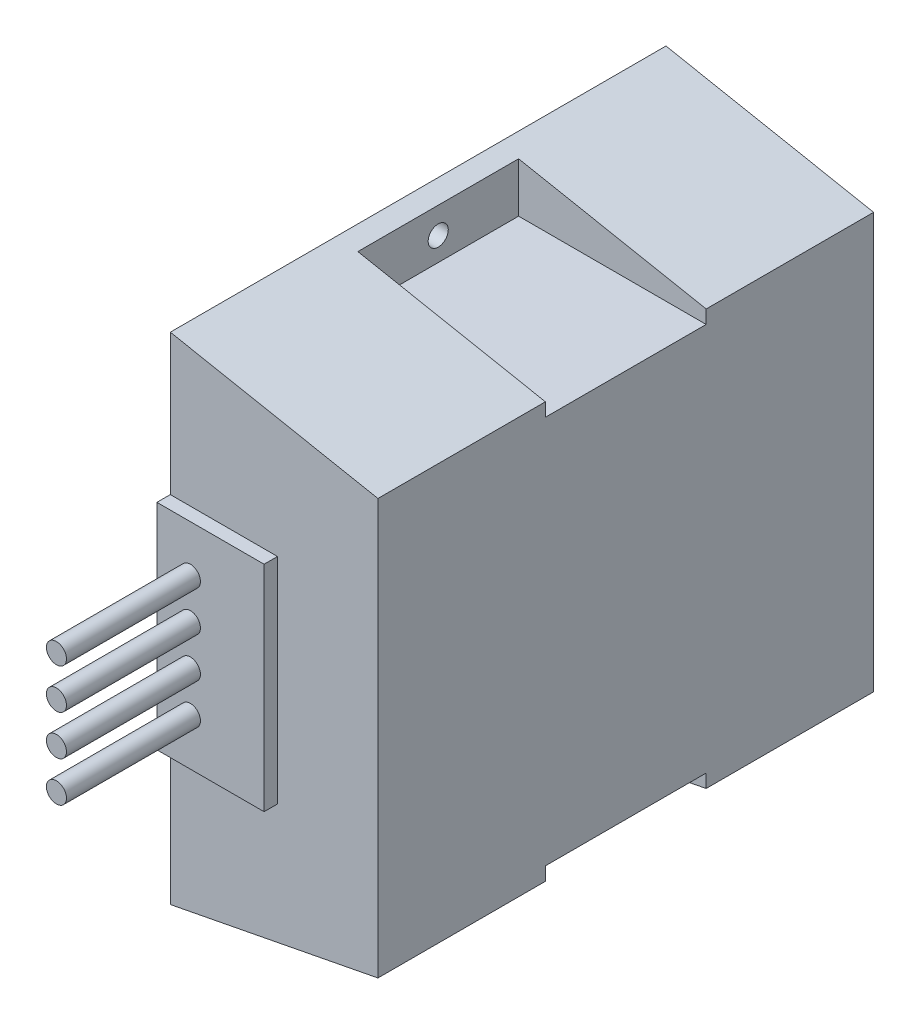
ISO-10303-21;
HEADER;
FILE_DESCRIPTION(('STEP AP214'),'2;1');
FILE_NAME('part.step','',(''),(''),'','','');
FILE_SCHEMA(('AUTOMOTIVE_DESIGN { 1 0 10303 214 1 1 1 1 }'));
ENDSEC;
DATA;
#1=APPLICATION_CONTEXT('core data for automotive mechanical design processes');
#2=APPLICATION_PROTOCOL_DEFINITION('international standard','automotive_design',2000,#1);
#3=PRODUCT_CONTEXT('',#1,'mechanical');
#4=PRODUCT('Part','Part','',(#3));
#5=PRODUCT_RELATED_PRODUCT_CATEGORY('part','',(#4));
#6=PRODUCT_DEFINITION_FORMATION('','',#4);
#7=PRODUCT_DEFINITION_CONTEXT('part definition',#1,'design');
#8=PRODUCT_DEFINITION('design','',#6,#7);
#9=PRODUCT_DEFINITION_SHAPE('','',#8);
#10=(LENGTH_UNIT() NAMED_UNIT(*) SI_UNIT(.MILLI.,.METRE.));
#11=(NAMED_UNIT(*) PLANE_ANGLE_UNIT() SI_UNIT($,.RADIAN.));
#12=(NAMED_UNIT(*) SI_UNIT($,.STERADIAN.) SOLID_ANGLE_UNIT());
#13=UNCERTAINTY_MEASURE_WITH_UNIT(LENGTH_MEASURE(1.E-05),#10,'distance_accuracy_value','');
#14=(GEOMETRIC_REPRESENTATION_CONTEXT(3) GLOBAL_UNCERTAINTY_ASSIGNED_CONTEXT((#13)) GLOBAL_UNIT_ASSIGNED_CONTEXT((#10,
#11,#12)) REPRESENTATION_CONTEXT('',''));
#15=CARTESIAN_POINT('',(0.,0.,0.));
#16=DIRECTION('',(0.,0.,1.));
#17=DIRECTION('',(1.,0.,0.));
#18=AXIS2_PLACEMENT_3D('',#15,#16,#17);
#19=CARTESIAN_POINT('',(31.,0.,0.));
#20=DIRECTION('',(1.,0.,0.));
#21=DIRECTION('',(0.,0.,-1.));
#22=AXIS2_PLACEMENT_3D('',#19,#20,#21);
#23=PLANE('',#22);
#24=DIRECTION('',(0.,0.,-1.));
#25=VECTOR('',#24,1.);
#26=CARTESIAN_POINT('',(31.,-29.,12.));
#27=LINE('',#26,#25);
#28=CARTESIAN_POINT('',(31.,-29.,12.));
#29=VERTEX_POINT('',#28);
#30=CARTESIAN_POINT('',(31.,-29.,-12.));
#31=VERTEX_POINT('',#30);
#32=EDGE_CURVE('E184',#29,#31,#27,.T.);
#33=ORIENTED_EDGE('',*,*,#32,.T.);
#34=DIRECTION('',(0.,-1.,0.));
#35=VECTOR('',#34,1.);
#36=CARTESIAN_POINT('',(31.,-37.,-12.));
#37=LINE('',#36,#35);
#38=CARTESIAN_POINT('',(31.,-31.,-12.));
#39=VERTEX_POINT('',#38);
#40=EDGE_CURVE('E181',#31,#39,#37,.T.);
#41=ORIENTED_EDGE('',*,*,#40,.T.);
#42=DIRECTION('',(0.,0.,-1.));
#43=VECTOR('',#42,1.);
#44=CARTESIAN_POINT('',(31.,-31.,37.));
#45=LINE('',#44,#43);
#46=CARTESIAN_POINT('',(31.,-31.,-37.));
#47=VERTEX_POINT('',#46);
#48=EDGE_CURVE('E326',#39,#47,#45,.T.);
#49=ORIENTED_EDGE('',*,*,#48,.T.);
#50=DIRECTION('',(0.,1.,0.));
#51=VECTOR('',#50,1.);
#52=CARTESIAN_POINT('',(31.,31.,-37.));
#53=LINE('',#52,#51);
#54=CARTESIAN_POINT('',(31.,31.,-37.));
#55=VERTEX_POINT('',#54);
#56=EDGE_CURVE('E328',#47,#55,#53,.T.);
#57=ORIENTED_EDGE('',*,*,#56,.T.);
#58=DIRECTION('',(0.,0.,1.));
#59=VECTOR('',#58,1.);
#60=CARTESIAN_POINT('',(31.,31.,37.));
#61=LINE('',#60,#59);
#62=CARTESIAN_POINT('',(31.,31.,-12.));
#63=VERTEX_POINT('',#62);
#64=EDGE_CURVE('E433',#55,#63,#61,.T.);
#65=ORIENTED_EDGE('',*,*,#64,.T.);
#66=DIRECTION('',(0.,1.,0.));
#67=VECTOR('',#66,1.);
#68=CARTESIAN_POINT('',(31.,37.,-12.));
#69=LINE('',#68,#67);
#70=CARTESIAN_POINT('',(31.,29.,-12.));
#71=VERTEX_POINT('',#70);
#72=EDGE_CURVE('E282',#71,#63,#69,.T.);
#73=ORIENTED_EDGE('',*,*,#72,.F.);
#74=DIRECTION('',(0.,0.,-1.));
#75=VECTOR('',#74,1.);
#76=CARTESIAN_POINT('',(31.,29.,12.));
#77=LINE('',#76,#75);
#78=CARTESIAN_POINT('',(31.,29.,12.));
#79=VERTEX_POINT('',#78);
#80=EDGE_CURVE('E510',#79,#71,#77,.T.);
#81=ORIENTED_EDGE('',*,*,#80,.F.);
#82=DIRECTION('',(0.,-1.,0.));
#83=VECTOR('',#82,1.);
#84=CARTESIAN_POINT('',(31.,37.,12.));
#85=LINE('',#84,#83);
#86=CARTESIAN_POINT('',(31.,31.,12.));
#87=VERTEX_POINT('',#86);
#88=EDGE_CURVE('E286',#87,#79,#85,.T.);
#89=ORIENTED_EDGE('',*,*,#88,.F.);
#90=CARTESIAN_POINT('',(31.,31.,37.));
#91=VERTEX_POINT('',#90);
#92=EDGE_CURVE('E339',#87,#91,#61,.T.);
#93=ORIENTED_EDGE('',*,*,#92,.T.);
#94=DIRECTION('',(0.,-1.,0.));
#95=VECTOR('',#94,1.);
#96=CARTESIAN_POINT('',(31.,31.,37.));
#97=LINE('',#96,#95);
#98=CARTESIAN_POINT('',(31.,-31.,37.));
#99=VERTEX_POINT('',#98);
#100=EDGE_CURVE('E336',#91,#99,#97,.T.);
#101=ORIENTED_EDGE('',*,*,#100,.T.);
#102=CARTESIAN_POINT('',(31.,-31.,12.));
#103=VERTEX_POINT('',#102);
#104=EDGE_CURVE('E303',#99,#103,#45,.T.);
#105=ORIENTED_EDGE('',*,*,#104,.T.);
#106=DIRECTION('',(0.,1.,0.));
#107=VECTOR('',#106,1.);
#108=CARTESIAN_POINT('',(31.,-37.,12.));
#109=LINE('',#108,#107);
#110=EDGE_CURVE('E265',#103,#29,#109,.T.);
#111=ORIENTED_EDGE('',*,*,#110,.T.);
#112=EDGE_LOOP('',(#33,#41,#49,#57,#65,#73,#81,#89,#93,#101,#105,#111));
#113=FACE_BOUND('',#112,.T.);
#114=ADVANCED_FACE('F42',(#113),#23,.T.);
#115=CARTESIAN_POINT('',(6.9027081243731,-35.6639919759278,0.));
#116=DIRECTION('',(0.19002190656586,-0.981779850590282,0.));
#117=DIRECTION('',(0.981779850590282,0.19002190656586,0.));
#118=AXIS2_PLACEMENT_3D('',#115,#116,#117);
#119=PLANE('',#118);
#120=ORIENTED_EDGE('',*,*,#48,.F.);
#121=DIRECTION('',(-0.981779850590282,-0.19002190656586,0.));
#122=VECTOR('',#121,1.);
#123=CARTESIAN_POINT('',(6.9027081243731,-35.6639919759278,-12.));
#124=LINE('',#123,#122);
#125=CARTESIAN_POINT('',(3.,-36.4193548387097,-12.));
#126=VERTEX_POINT('',#125);
#127=EDGE_CURVE('E298',#39,#126,#124,.T.);
#128=ORIENTED_EDGE('',*,*,#127,.T.);
#129=DIRECTION('',(0.,0.,1.));
#130=VECTOR('',#129,1.);
#131=CARTESIAN_POINT('',(3.,-36.4193548387097,0.));
#132=LINE('',#131,#130);
#133=CARTESIAN_POINT('',(3.,-36.4193548387097,12.));
#134=VERTEX_POINT('',#133);
#135=EDGE_CURVE('E315',#126,#134,#132,.T.);
#136=ORIENTED_EDGE('',*,*,#135,.T.);
#137=DIRECTION('',(0.981779850590282,0.19002190656586,0.));
#138=VECTOR('',#137,1.);
#139=CARTESIAN_POINT('',(6.9027081243731,-35.6639919759278,12.));
#140=LINE('',#139,#138);
#141=EDGE_CURVE('E308',#134,#103,#140,.T.);
#142=ORIENTED_EDGE('',*,*,#141,.T.);
#143=ORIENTED_EDGE('',*,*,#104,.F.);
#144=DIRECTION('',(-0.981779850590281,-0.19002190656586,0.));
#145=VECTOR('',#144,1.);
#146=CARTESIAN_POINT('',(31.,-31.,37.));
#147=LINE('',#146,#145);
#148=CARTESIAN_POINT('',(0.,-37.,37.));
#149=VERTEX_POINT('',#148);
#150=EDGE_CURVE('E353',#99,#149,#147,.T.);
#151=ORIENTED_EDGE('',*,*,#150,.T.);
#152=DIRECTION('',(0.,0.,-1.));
#153=VECTOR('',#152,1.);
#154=CARTESIAN_POINT('',(0.,-37.,37.));
#155=LINE('',#154,#153);
#156=CARTESIAN_POINT('',(0.,-37.,-37.));
#157=VERTEX_POINT('',#156);
#158=EDGE_CURVE('E219',#149,#157,#155,.T.);
#159=ORIENTED_EDGE('',*,*,#158,.T.);
#160=DIRECTION('',(-0.981779850590281,-0.19002190656586,0.));
#161=VECTOR('',#160,1.);
#162=CARTESIAN_POINT('',(31.,-31.,-37.));
#163=LINE('',#162,#161);
#164=EDGE_CURVE('E382',#47,#157,#163,.T.);
#165=ORIENTED_EDGE('',*,*,#164,.F.);
#166=EDGE_LOOP('',(#120,#128,#136,#142,#143,#151,#159,#165));
#167=FACE_BOUND('',#166,.T.);
#168=ADVANCED_FACE('F311',(#167),#119,.T.);
#169=CARTESIAN_POINT('',(0.,0.,0.));
#170=DIRECTION('',(1.,0.,0.));
#171=DIRECTION('',(0.,0.,-1.));
#172=AXIS2_PLACEMENT_3D('',#169,#170,#171);
#173=PLANE('',#172);
#174=CARTESIAN_POINT('',(0.,32.5,0.));
#175=DIRECTION('',(1.,0.,0.));
#176=DIRECTION('',(0.,0.,1.));
#177=AXIS2_PLACEMENT_3D('',#174,#175,#176);
#178=CIRCLE('',#177,1.5);
#179=CARTESIAN_POINT('',(0.,32.5,1.5));
#180=VERTEX_POINT('',#179);
#181=EDGE_CURVE('E781',#180,#180,#178,.T.);
#182=ORIENTED_EDGE('',*,*,#181,.T.);
#183=EDGE_LOOP('',(#182));
#184=FACE_BOUND('',#183,.T.);
#185=CARTESIAN_POINT('',(0.,-32.5,0.));
#186=DIRECTION('',(-1.,0.,0.));
#187=DIRECTION('',(0.,0.,1.));
#188=AXIS2_PLACEMENT_3D('',#185,#186,#187);
#189=CIRCLE('',#188,1.5);
#190=CARTESIAN_POINT('',(0.,-32.5,1.5));
#191=VERTEX_POINT('',#190);
#192=EDGE_CURVE('E783',#191,#191,#189,.T.);
#193=ORIENTED_EDGE('',*,*,#192,.F.);
#194=EDGE_LOOP('',(#193));
#195=FACE_BOUND('',#194,.T.);
#196=DIRECTION('',(0.,1.,0.));
#197=VECTOR('',#196,1.);
#198=CARTESIAN_POINT('',(0.,37.,-37.));
#199=LINE('',#198,#197);
#200=CARTESIAN_POINT('',(0.,37.,-37.));
#201=VERTEX_POINT('',#200);
#202=EDGE_CURVE('E212',#157,#201,#199,.T.);
#203=ORIENTED_EDGE('',*,*,#202,.F.);
#204=ORIENTED_EDGE('',*,*,#158,.F.);
#205=DIRECTION('',(0.,-1.,0.));
#206=VECTOR('',#205,1.);
#207=CARTESIAN_POINT('',(0.,37.,37.));
#208=LINE('',#207,#206);
#209=CARTESIAN_POINT('',(0.,-16.,37.));
#210=VERTEX_POINT('',#209);
#211=EDGE_CURVE('E179',#210,#149,#208,.T.);
#212=ORIENTED_EDGE('',*,*,#211,.F.);
#213=DIRECTION('',(0.,0.,-1.));
#214=VECTOR('',#213,1.);
#215=CARTESIAN_POINT('',(0.,-16.,39.));
#216=LINE('',#215,#214);
#217=CARTESIAN_POINT('',(0.,-16.,39.));
#218=VERTEX_POINT('',#217);
#219=EDGE_CURVE('E161',#218,#210,#216,.T.);
#220=ORIENTED_EDGE('',*,*,#219,.F.);
#221=DIRECTION('',(0.,-1.,0.));
#222=VECTOR('',#221,1.);
#223=CARTESIAN_POINT('',(0.,16.,39.));
#224=LINE('',#223,#222);
#225=CARTESIAN_POINT('',(0.,16.,39.));
#226=VERTEX_POINT('',#225);
#227=EDGE_CURVE('E167',#226,#218,#224,.T.);
#228=ORIENTED_EDGE('',*,*,#227,.F.);
#229=DIRECTION('',(0.,0.,-1.));
#230=VECTOR('',#229,1.);
#231=CARTESIAN_POINT('',(0.,16.,39.));
#232=LINE('',#231,#230);
#233=CARTESIAN_POINT('',(0.,16.,37.));
#234=VERTEX_POINT('',#233);
#235=EDGE_CURVE('E256',#226,#234,#232,.T.);
#236=ORIENTED_EDGE('',*,*,#235,.T.);
#237=CARTESIAN_POINT('',(0.,37.,37.));
#238=VERTEX_POINT('',#237);
#239=EDGE_CURVE('E194',#238,#234,#208,.T.);
#240=ORIENTED_EDGE('',*,*,#239,.F.);
#241=DIRECTION('',(0.,0.,1.));
#242=VECTOR('',#241,1.);
#243=CARTESIAN_POINT('',(0.,37.,37.));
#244=LINE('',#243,#242);
#245=EDGE_CURVE('E196',#201,#238,#244,.T.);
#246=ORIENTED_EDGE('',*,*,#245,.F.);
#247=EDGE_LOOP('',(#203,#204,#212,#220,#228,#236,#240,#246));
#248=FACE_BOUND('',#247,.T.);
#249=ADVANCED_FACE('F44',(#184,#195,#248),#173,.F.);
#250=CARTESIAN_POINT('',(0.,0.,-37.));
#251=DIRECTION('',(0.,0.,-1.));
#252=DIRECTION('',(-1.,0.,0.));
#253=AXIS2_PLACEMENT_3D('',#250,#251,#252);
#254=PLANE('',#253);
#255=ORIENTED_EDGE('',*,*,#164,.T.);
#256=ORIENTED_EDGE('',*,*,#202,.T.);
#257=DIRECTION('',(-0.981779850590281,0.190021906565861,0.));
#258=VECTOR('',#257,1.);
#259=CARTESIAN_POINT('',(31.,31.,-37.));
#260=LINE('',#259,#258);
#261=EDGE_CURVE('E364',#55,#201,#260,.T.);
#262=ORIENTED_EDGE('',*,*,#261,.F.);
#263=ORIENTED_EDGE('',*,*,#56,.F.);
#264=EDGE_LOOP('',(#255,#256,#262,#263));
#265=FACE_BOUND('',#264,.T.);
#266=ADVANCED_FACE('F384',(#265),#254,.T.);
#267=CARTESIAN_POINT('',(6.90270812437314,35.6639919759278,0.));
#268=DIRECTION('',(0.190021906565861,0.981779850590281,0.));
#269=DIRECTION('',(-0.981779850590281,0.190021906565861,0.));
#270=AXIS2_PLACEMENT_3D('',#267,#268,#269);
#271=PLANE('',#270);
#272=DIRECTION('',(-0.981779850590281,0.190021906565861,0.));
#273=VECTOR('',#272,1.);
#274=CARTESIAN_POINT('',(6.90270812437314,35.6639919759278,-12.));
#275=LINE('',#274,#273);
#276=CARTESIAN_POINT('',(3.,36.4193548387097,-12.));
#277=VERTEX_POINT('',#276);
#278=EDGE_CURVE('E318',#63,#277,#275,.T.);
#279=ORIENTED_EDGE('',*,*,#278,.F.);
#280=ORIENTED_EDGE('',*,*,#64,.F.);
#281=ORIENTED_EDGE('',*,*,#261,.T.);
#282=ORIENTED_EDGE('',*,*,#245,.T.);
#283=DIRECTION('',(-0.981779850590281,0.190021906565861,0.));
#284=VECTOR('',#283,1.);
#285=CARTESIAN_POINT('',(31.,31.,37.));
#286=LINE('',#285,#284);
#287=EDGE_CURVE('E220',#91,#238,#286,.T.);
#288=ORIENTED_EDGE('',*,*,#287,.F.);
#289=ORIENTED_EDGE('',*,*,#92,.F.);
#290=DIRECTION('',(0.981779850590281,-0.190021906565861,0.));
#291=VECTOR('',#290,1.);
#292=CARTESIAN_POINT('',(6.90270812437314,35.6639919759278,12.));
#293=LINE('',#292,#291);
#294=CARTESIAN_POINT('',(3.,36.4193548387097,12.));
#295=VERTEX_POINT('',#294);
#296=EDGE_CURVE('E470',#295,#87,#293,.T.);
#297=ORIENTED_EDGE('',*,*,#296,.F.);
#298=DIRECTION('',(0.,0.,-1.));
#299=VECTOR('',#298,1.);
#300=CARTESIAN_POINT('',(3.,36.4193548387097,0.));
#301=LINE('',#300,#299);
#302=EDGE_CURVE('E224',#295,#277,#301,.T.);
#303=ORIENTED_EDGE('',*,*,#302,.T.);
#304=EDGE_LOOP('',(#279,#280,#281,#282,#288,#289,#297,#303));
#305=FACE_BOUND('',#304,.T.);
#306=ADVANCED_FACE('F358',(#305),#271,.T.);
#307=CARTESIAN_POINT('',(0.,0.,37.));
#308=DIRECTION('',(0.,0.,1.));
#309=DIRECTION('',(1.,0.,0.));
#310=AXIS2_PLACEMENT_3D('',#307,#308,#309);
#311=PLANE('',#310);
#312=DIRECTION('',(-1.,0.,0.));
#313=VECTOR('',#312,1.);
#314=CARTESIAN_POINT('',(16.,16.,37.));
#315=LINE('',#314,#313);
#316=CARTESIAN_POINT('',(16.,16.,37.));
#317=VERTEX_POINT('',#316);
#318=EDGE_CURVE('E60',#317,#234,#315,.T.);
#319=ORIENTED_EDGE('',*,*,#318,.F.);
#320=DIRECTION('',(0.,1.,0.));
#321=VECTOR('',#320,1.);
#322=CARTESIAN_POINT('',(16.,16.,37.));
#323=LINE('',#322,#321);
#324=CARTESIAN_POINT('',(16.,-16.,37.));
#325=VERTEX_POINT('',#324);
#326=EDGE_CURVE('E241',#325,#317,#323,.T.);
#327=ORIENTED_EDGE('',*,*,#326,.F.);
#328=DIRECTION('',(1.,0.,0.));
#329=VECTOR('',#328,1.);
#330=CARTESIAN_POINT('',(16.,-16.,37.));
#331=LINE('',#330,#329);
#332=EDGE_CURVE('E66',#210,#325,#331,.T.);
#333=ORIENTED_EDGE('',*,*,#332,.F.);
#334=ORIENTED_EDGE('',*,*,#211,.T.);
#335=ORIENTED_EDGE('',*,*,#150,.F.);
#336=ORIENTED_EDGE('',*,*,#100,.F.);
#337=ORIENTED_EDGE('',*,*,#287,.T.);
#338=ORIENTED_EDGE('',*,*,#239,.T.);
#339=EDGE_LOOP('',(#319,#327,#333,#334,#335,#336,#337,#338));
#340=FACE_BOUND('',#339,.T.);
#341=ADVANCED_FACE('F352',(#340),#311,.T.);
#342=CARTESIAN_POINT('',(3.,37.,-12.));
#343=DIRECTION('',(0.,0.,-1.));
#344=DIRECTION('',(0.,1.,0.));
#345=AXIS2_PLACEMENT_3D('',#342,#343,#344);
#346=PLANE('',#345);
#347=ORIENTED_EDGE('',*,*,#278,.T.);
#348=DIRECTION('',(0.,1.,0.));
#349=VECTOR('',#348,1.);
#350=CARTESIAN_POINT('',(3.,37.,-12.));
#351=LINE('',#350,#349);
#352=CARTESIAN_POINT('',(3.,29.,-12.));
#353=VERTEX_POINT('',#352);
#354=EDGE_CURVE('E278',#353,#277,#351,.T.);
#355=ORIENTED_EDGE('',*,*,#354,.F.);
#356=DIRECTION('',(1.,0.,0.));
#357=VECTOR('',#356,1.);
#358=CARTESIAN_POINT('',(3.,29.,-12.));
#359=LINE('',#358,#357);
#360=EDGE_CURVE('E455',#353,#71,#359,.T.);
#361=ORIENTED_EDGE('',*,*,#360,.T.);
#362=ORIENTED_EDGE('',*,*,#72,.T.);
#363=EDGE_LOOP('',(#347,#355,#361,#362));
#364=FACE_BOUND('',#363,.T.);
#365=ADVANCED_FACE('F506',(#364),#346,.F.);
#366=CARTESIAN_POINT('',(3.,29.,12.));
#367=DIRECTION('',(0.,-1.,0.));
#368=DIRECTION('',(0.,0.,-1.));
#369=AXIS2_PLACEMENT_3D('',#366,#367,#368);
#370=PLANE('',#369);
#371=ORIENTED_EDGE('',*,*,#80,.T.);
#372=ORIENTED_EDGE('',*,*,#360,.F.);
#373=DIRECTION('',(0.,0.,-1.));
#374=VECTOR('',#373,1.);
#375=CARTESIAN_POINT('',(3.,29.,12.));
#376=LINE('',#375,#374);
#377=CARTESIAN_POINT('',(3.,29.,12.));
#378=VERTEX_POINT('',#377);
#379=EDGE_CURVE('E519',#378,#353,#376,.T.);
#380=ORIENTED_EDGE('',*,*,#379,.F.);
#381=DIRECTION('',(1.,0.,0.));
#382=VECTOR('',#381,1.);
#383=CARTESIAN_POINT('',(3.,29.,12.));
#384=LINE('',#383,#382);
#385=EDGE_CURVE('E457',#378,#79,#384,.T.);
#386=ORIENTED_EDGE('',*,*,#385,.T.);
#387=EDGE_LOOP('',(#371,#372,#380,#386));
#388=FACE_BOUND('',#387,.T.);
#389=ADVANCED_FACE('F529',(#388),#370,.F.);
#390=CARTESIAN_POINT('',(3.,37.,12.));
#391=DIRECTION('',(0.,0.,1.));
#392=DIRECTION('',(0.,-1.,0.));
#393=AXIS2_PLACEMENT_3D('',#390,#391,#392);
#394=PLANE('',#393);
#395=ORIENTED_EDGE('',*,*,#296,.T.);
#396=ORIENTED_EDGE('',*,*,#88,.T.);
#397=ORIENTED_EDGE('',*,*,#385,.F.);
#398=DIRECTION('',(0.,-1.,0.));
#399=VECTOR('',#398,1.);
#400=CARTESIAN_POINT('',(3.,37.,12.));
#401=LINE('',#400,#399);
#402=EDGE_CURVE('E514',#295,#378,#401,.T.);
#403=ORIENTED_EDGE('',*,*,#402,.F.);
#404=EDGE_LOOP('',(#395,#396,#397,#403));
#405=FACE_BOUND('',#404,.T.);
#406=ADVANCED_FACE('F528',(#405),#394,.F.);
#407=CARTESIAN_POINT('',(3.,0.,0.));
#408=DIRECTION('',(1.,0.,0.));
#409=DIRECTION('',(0.,0.,-1.));
#410=AXIS2_PLACEMENT_3D('',#407,#408,#409);
#411=PLANE('',#410);
#412=CARTESIAN_POINT('',(3.,32.5,0.));
#413=DIRECTION('',(1.,0.,0.));
#414=DIRECTION('',(0.,0.,-1.));
#415=AXIS2_PLACEMENT_3D('',#412,#413,#414);
#416=CIRCLE('',#415,1.5);
#417=CARTESIAN_POINT('',(3.,32.5,-1.5));
#418=VERTEX_POINT('',#417);
#419=EDGE_CURVE('E47',#418,#418,#416,.F.);
#420=ORIENTED_EDGE('',*,*,#419,.T.);
#421=EDGE_LOOP('',(#420));
#422=FACE_BOUND('',#421,.T.);
#423=ORIENTED_EDGE('',*,*,#402,.T.);
#424=ORIENTED_EDGE('',*,*,#379,.T.);
#425=ORIENTED_EDGE('',*,*,#354,.T.);
#426=ORIENTED_EDGE('',*,*,#302,.F.);
#427=EDGE_LOOP('',(#423,#424,#425,#426));
#428=FACE_BOUND('',#427,.T.);
#429=ADVANCED_FACE('F525',(#422,#428),#411,.T.);
#430=CARTESIAN_POINT('',(3.,-37.,-12.));
#431=DIRECTION('',(0.,0.,1.));
#432=DIRECTION('',(0.,-1.,0.));
#433=AXIS2_PLACEMENT_3D('',#430,#431,#432);
#434=PLANE('',#433);
#435=ORIENTED_EDGE('',*,*,#40,.F.);
#436=DIRECTION('',(1.,0.,0.));
#437=VECTOR('',#436,1.);
#438=CARTESIAN_POINT('',(3.,-29.,-12.));
#439=LINE('',#438,#437);
#440=CARTESIAN_POINT('',(3.,-29.,-12.));
#441=VERTEX_POINT('',#440);
#442=EDGE_CURVE('E269',#441,#31,#439,.T.);
#443=ORIENTED_EDGE('',*,*,#442,.F.);
#444=DIRECTION('',(0.,-1.,0.));
#445=VECTOR('',#444,1.);
#446=CARTESIAN_POINT('',(3.,-37.,-12.));
#447=LINE('',#446,#445);
#448=EDGE_CURVE('E261',#441,#126,#447,.T.);
#449=ORIENTED_EDGE('',*,*,#448,.T.);
#450=ORIENTED_EDGE('',*,*,#127,.F.);
#451=EDGE_LOOP('',(#435,#443,#449,#450));
#452=FACE_BOUND('',#451,.T.);
#453=ADVANCED_FACE('F296',(#452),#434,.T.);
#454=CARTESIAN_POINT('',(3.,-37.,12.));
#455=DIRECTION('',(0.,0.,-1.));
#456=DIRECTION('',(0.,1.,0.));
#457=AXIS2_PLACEMENT_3D('',#454,#455,#456);
#458=PLANE('',#457);
#459=DIRECTION('',(0.,1.,0.));
#460=VECTOR('',#459,1.);
#461=CARTESIAN_POINT('',(3.,-37.,12.));
#462=LINE('',#461,#460);
#463=CARTESIAN_POINT('',(3.,-29.,12.));
#464=VERTEX_POINT('',#463);
#465=EDGE_CURVE('E267',#134,#464,#462,.T.);
#466=ORIENTED_EDGE('',*,*,#465,.T.);
#467=DIRECTION('',(1.,0.,0.));
#468=VECTOR('',#467,1.);
#469=CARTESIAN_POINT('',(3.,-29.,12.));
#470=LINE('',#469,#468);
#471=EDGE_CURVE('E281',#464,#29,#470,.T.);
#472=ORIENTED_EDGE('',*,*,#471,.T.);
#473=ORIENTED_EDGE('',*,*,#110,.F.);
#474=ORIENTED_EDGE('',*,*,#141,.F.);
#475=EDGE_LOOP('',(#466,#472,#473,#474));
#476=FACE_BOUND('',#475,.T.);
#477=ADVANCED_FACE('F307',(#476),#458,.T.);
#478=CARTESIAN_POINT('',(3.,-29.,12.));
#479=DIRECTION('',(0.,-1.,0.));
#480=DIRECTION('',(0.,0.,-1.));
#481=AXIS2_PLACEMENT_3D('',#478,#479,#480);
#482=PLANE('',#481);
#483=ORIENTED_EDGE('',*,*,#32,.F.);
#484=ORIENTED_EDGE('',*,*,#471,.F.);
#485=DIRECTION('',(0.,0.,-1.));
#486=VECTOR('',#485,1.);
#487=CARTESIAN_POINT('',(3.,-29.,12.));
#488=LINE('',#487,#486);
#489=EDGE_CURVE('E264',#464,#441,#488,.T.);
#490=ORIENTED_EDGE('',*,*,#489,.T.);
#491=ORIENTED_EDGE('',*,*,#442,.T.);
#492=EDGE_LOOP('',(#483,#484,#490,#491));
#493=FACE_BOUND('',#492,.T.);
#494=ADVANCED_FACE('F291',(#493),#482,.T.);
#495=CARTESIAN_POINT('',(3.,0.,0.));
#496=DIRECTION('',(1.,0.,0.));
#497=DIRECTION('',(0.,0.,-1.));
#498=AXIS2_PLACEMENT_3D('',#495,#496,#497);
#499=PLANE('',#498);
#500=CARTESIAN_POINT('',(3.,-32.5,0.));
#501=DIRECTION('',(1.,0.,0.));
#502=DIRECTION('',(0.,0.,-1.));
#503=AXIS2_PLACEMENT_3D('',#500,#501,#502);
#504=CIRCLE('',#503,1.5);
#505=CARTESIAN_POINT('',(3.,-32.5,-1.5));
#506=VERTEX_POINT('',#505);
#507=EDGE_CURVE('E787',#506,#506,#504,.T.);
#508=ORIENTED_EDGE('',*,*,#507,.F.);
#509=EDGE_LOOP('',(#508));
#510=FACE_BOUND('',#509,.T.);
#511=ORIENTED_EDGE('',*,*,#448,.F.);
#512=ORIENTED_EDGE('',*,*,#489,.F.);
#513=ORIENTED_EDGE('',*,*,#465,.F.);
#514=ORIENTED_EDGE('',*,*,#135,.F.);
#515=EDGE_LOOP('',(#511,#512,#513,#514));
#516=FACE_BOUND('',#515,.T.);
#517=ADVANCED_FACE('F608',(#510,#516),#499,.T.);
#518=CARTESIAN_POINT('',(16.,-16.,39.));
#519=DIRECTION('',(0.,1.,0.));
#520=DIRECTION('',(-1.,0.,0.));
#521=AXIS2_PLACEMENT_3D('',#518,#519,#520);
#522=PLANE('',#521);
#523=ORIENTED_EDGE('',*,*,#332,.T.);
#524=DIRECTION('',(0.,0.,-1.));
#525=VECTOR('',#524,1.);
#526=CARTESIAN_POINT('',(16.,-16.,39.));
#527=LINE('',#526,#525);
#528=CARTESIAN_POINT('',(16.,-16.,39.));
#529=VERTEX_POINT('',#528);
#530=EDGE_CURVE('E163',#529,#325,#527,.T.);
#531=ORIENTED_EDGE('',*,*,#530,.F.);
#532=DIRECTION('',(1.,0.,0.));
#533=VECTOR('',#532,1.);
#534=CARTESIAN_POINT('',(16.,-16.,39.));
#535=LINE('',#534,#533);
#536=EDGE_CURVE('E157',#218,#529,#535,.T.);
#537=ORIENTED_EDGE('',*,*,#536,.F.);
#538=ORIENTED_EDGE('',*,*,#219,.T.);
#539=EDGE_LOOP('',(#523,#531,#537,#538));
#540=FACE_BOUND('',#539,.T.);
#541=ADVANCED_FACE('F159',(#540),#522,.F.);
#542=CARTESIAN_POINT('',(16.,16.,39.));
#543=DIRECTION('',(-1.,0.,0.));
#544=DIRECTION('',(0.,-1.,0.));
#545=AXIS2_PLACEMENT_3D('',#542,#543,#544);
#546=PLANE('',#545);
#547=ORIENTED_EDGE('',*,*,#326,.T.);
#548=DIRECTION('',(0.,0.,-1.));
#549=VECTOR('',#548,1.);
#550=CARTESIAN_POINT('',(16.,16.,39.));
#551=LINE('',#550,#549);
#552=CARTESIAN_POINT('',(16.,16.,39.));
#553=VERTEX_POINT('',#552);
#554=EDGE_CURVE('E186',#553,#317,#551,.T.);
#555=ORIENTED_EDGE('',*,*,#554,.F.);
#556=DIRECTION('',(0.,1.,0.));
#557=VECTOR('',#556,1.);
#558=CARTESIAN_POINT('',(16.,16.,39.));
#559=LINE('',#558,#557);
#560=EDGE_CURVE('E166',#529,#553,#559,.T.);
#561=ORIENTED_EDGE('',*,*,#560,.F.);
#562=ORIENTED_EDGE('',*,*,#530,.T.);
#563=EDGE_LOOP('',(#547,#555,#561,#562));
#564=FACE_BOUND('',#563,.T.);
#565=ADVANCED_FACE('F622',(#564),#546,.F.);
#566=CARTESIAN_POINT('',(16.,16.,39.));
#567=DIRECTION('',(0.,-1.,0.));
#568=DIRECTION('',(0.,0.,-1.));
#569=AXIS2_PLACEMENT_3D('',#566,#567,#568);
#570=PLANE('',#569);
#571=ORIENTED_EDGE('',*,*,#318,.T.);
#572=ORIENTED_EDGE('',*,*,#235,.F.);
#573=DIRECTION('',(-1.,0.,0.));
#574=VECTOR('',#573,1.);
#575=CARTESIAN_POINT('',(16.,16.,39.));
#576=LINE('',#575,#574);
#577=EDGE_CURVE('E172',#553,#226,#576,.T.);
#578=ORIENTED_EDGE('',*,*,#577,.F.);
#579=ORIENTED_EDGE('',*,*,#554,.T.);
#580=EDGE_LOOP('',(#571,#572,#578,#579));
#581=FACE_BOUND('',#580,.T.);
#582=ADVANCED_FACE('F629',(#581),#570,.F.);
#583=CARTESIAN_POINT('',(0.,0.,39.));
#584=DIRECTION('',(0.,0.,-1.));
#585=DIRECTION('',(-1.,0.,0.));
#586=AXIS2_PLACEMENT_3D('',#583,#584,#585);
#587=PLANE('',#586);
#588=CARTESIAN_POINT('',(5.,9.,39.));
#589=DIRECTION('',(0.,0.,-1.));
#590=DIRECTION('',(1.,0.,0.));
#591=AXIS2_PLACEMENT_3D('',#588,#589,#590);
#592=CIRCLE('',#591,1.5);
#593=CARTESIAN_POINT('',(6.5,9.,39.));
#594=VERTEX_POINT('',#593);
#595=EDGE_CURVE('E792',#594,#594,#592,.T.);
#596=ORIENTED_EDGE('',*,*,#595,.T.);
#597=EDGE_LOOP('',(#596));
#598=FACE_BOUND('',#597,.T.);
#599=CARTESIAN_POINT('',(5.,3.,39.));
#600=DIRECTION('',(0.,0.,-1.));
#601=DIRECTION('',(1.,0.,0.));
#602=AXIS2_PLACEMENT_3D('',#599,#600,#601);
#603=CIRCLE('',#602,1.5);
#604=CARTESIAN_POINT('',(6.5,3.,39.));
#605=VERTEX_POINT('',#604);
#606=EDGE_CURVE('E791',#605,#605,#603,.T.);
#607=ORIENTED_EDGE('',*,*,#606,.T.);
#608=EDGE_LOOP('',(#607));
#609=FACE_BOUND('',#608,.T.);
#610=CARTESIAN_POINT('',(5.,-9.,39.));
#611=DIRECTION('',(0.,0.,-1.));
#612=DIRECTION('',(-1.,0.,0.));
#613=AXIS2_PLACEMENT_3D('',#610,#611,#612);
#614=CIRCLE('',#613,1.5);
#615=CARTESIAN_POINT('',(3.5,-9.,39.));
#616=VERTEX_POINT('',#615);
#617=EDGE_CURVE('E12',#616,#616,#614,.F.);
#618=ORIENTED_EDGE('',*,*,#617,.F.);
#619=EDGE_LOOP('',(#618));
#620=FACE_BOUND('',#619,.T.);
#621=CARTESIAN_POINT('',(5.,-3.,39.));
#622=DIRECTION('',(0.,0.,-1.));
#623=DIRECTION('',(-1.,0.,0.));
#624=AXIS2_PLACEMENT_3D('',#621,#622,#623);
#625=CIRCLE('',#624,1.5);
#626=CARTESIAN_POINT('',(3.5,-3.,39.));
#627=VERTEX_POINT('',#626);
#628=EDGE_CURVE('E52',#627,#627,#625,.F.);
#629=ORIENTED_EDGE('',*,*,#628,.F.);
#630=EDGE_LOOP('',(#629));
#631=FACE_BOUND('',#630,.T.);
#632=ORIENTED_EDGE('',*,*,#227,.T.);
#633=ORIENTED_EDGE('',*,*,#536,.T.);
#634=ORIENTED_EDGE('',*,*,#560,.T.);
#635=ORIENTED_EDGE('',*,*,#577,.T.);
#636=EDGE_LOOP('',(#632,#633,#634,#635));
#637=FACE_BOUND('',#636,.T.);
#638=ADVANCED_FACE('F170',(#598,#609,#620,#631,#637),#587,.F.);
#639=CARTESIAN_POINT('',(5.,-3.,59.));
#640=DIRECTION('',(0.,0.,-1.));
#641=DIRECTION('',(-1.,0.,0.));
#642=AXIS2_PLACEMENT_3D('',#639,#640,#641);
#643=CYLINDRICAL_SURFACE('',#642,1.5);
#644=CARTESIAN_POINT('',(5.,-3.,59.));
#645=DIRECTION('',(0.,0.,1.));
#646=DIRECTION('',(1.,0.,0.));
#647=AXIS2_PLACEMENT_3D('',#644,#645,#646);
#648=CIRCLE('',#647,1.5);
#649=CARTESIAN_POINT('',(6.5,-3.,59.));
#650=VERTEX_POINT('',#649);
#651=EDGE_CURVE('E242',#650,#650,#648,.T.);
#652=ORIENTED_EDGE('',*,*,#651,.F.);
#653=EDGE_LOOP('',(#652));
#654=FACE_BOUND('',#653,.T.);
#655=ORIENTED_EDGE('',*,*,#628,.T.);
#656=EDGE_LOOP('',(#655));
#657=FACE_BOUND('',#656,.T.);
#658=ADVANCED_FACE('F645',(#654,#657),#643,.T.);
#659=CARTESIAN_POINT('',(5.,-3.,59.));
#660=DIRECTION('',(0.,0.,1.));
#661=DIRECTION('',(1.,0.,0.));
#662=AXIS2_PLACEMENT_3D('',#659,#660,#661);
#663=PLANE('',#662);
#664=ORIENTED_EDGE('',*,*,#651,.T.);
#665=EDGE_LOOP('',(#664));
#666=FACE_BOUND('',#665,.T.);
#667=ADVANCED_FACE('F654',(#666),#663,.T.);
#668=CARTESIAN_POINT('',(5.,-9.,59.));
#669=DIRECTION('',(0.,0.,-1.));
#670=DIRECTION('',(-1.,0.,0.));
#671=AXIS2_PLACEMENT_3D('',#668,#669,#670);
#672=CYLINDRICAL_SURFACE('',#671,1.5);
#673=CARTESIAN_POINT('',(5.,-9.,59.));
#674=DIRECTION('',(0.,0.,1.));
#675=DIRECTION('',(1.,0.,0.));
#676=AXIS2_PLACEMENT_3D('',#673,#674,#675);
#677=CIRCLE('',#676,1.5);
#678=CARTESIAN_POINT('',(6.5,-9.,59.));
#679=VERTEX_POINT('',#678);
#680=EDGE_CURVE('E246',#679,#679,#677,.T.);
#681=ORIENTED_EDGE('',*,*,#680,.F.);
#682=EDGE_LOOP('',(#681));
#683=FACE_BOUND('',#682,.T.);
#684=ORIENTED_EDGE('',*,*,#617,.T.);
#685=EDGE_LOOP('',(#684));
#686=FACE_BOUND('',#685,.T.);
#687=ADVANCED_FACE('F662',(#683,#686),#672,.T.);
#688=CARTESIAN_POINT('',(5.,-9.,59.));
#689=DIRECTION('',(0.,0.,1.));
#690=DIRECTION('',(1.,0.,0.));
#691=AXIS2_PLACEMENT_3D('',#688,#689,#690);
#692=PLANE('',#691);
#693=ORIENTED_EDGE('',*,*,#680,.T.);
#694=EDGE_LOOP('',(#693));
#695=FACE_BOUND('',#694,.T.);
#696=ADVANCED_FACE('F669',(#695),#692,.T.);
#697=CARTESIAN_POINT('',(5.,3.,59.));
#698=DIRECTION('',(0.,0.,-1.));
#699=DIRECTION('',(-1.,0.,0.));
#700=AXIS2_PLACEMENT_3D('',#697,#698,#699);
#701=CYLINDRICAL_SURFACE('',#700,1.5);
#702=CARTESIAN_POINT('',(5.,3.,59.));
#703=DIRECTION('',(0.,0.,-1.));
#704=DIRECTION('',(1.,0.,0.));
#705=AXIS2_PLACEMENT_3D('',#702,#703,#704);
#706=CIRCLE('',#705,1.5);
#707=CARTESIAN_POINT('',(6.5,3.,59.));
#708=VERTEX_POINT('',#707);
#709=EDGE_CURVE('E251',#708,#708,#706,.T.);
#710=ORIENTED_EDGE('',*,*,#709,.T.);
#711=EDGE_LOOP('',(#710));
#712=FACE_BOUND('',#711,.T.);
#713=ORIENTED_EDGE('',*,*,#606,.F.);
#714=EDGE_LOOP('',(#713));
#715=FACE_BOUND('',#714,.T.);
#716=ADVANCED_FACE('F676',(#712,#715),#701,.T.);
#717=CARTESIAN_POINT('',(5.,3.,59.));
#718=DIRECTION('',(0.,0.,1.));
#719=DIRECTION('',(1.,0.,0.));
#720=AXIS2_PLACEMENT_3D('',#717,#718,#719);
#721=PLANE('',#720);
#722=ORIENTED_EDGE('',*,*,#709,.F.);
#723=EDGE_LOOP('',(#722));
#724=FACE_BOUND('',#723,.T.);
#725=ADVANCED_FACE('F683',(#724),#721,.T.);
#726=CARTESIAN_POINT('',(5.,9.,59.));
#727=DIRECTION('',(0.,0.,-1.));
#728=DIRECTION('',(-1.,0.,0.));
#729=AXIS2_PLACEMENT_3D('',#726,#727,#728);
#730=CYLINDRICAL_SURFACE('',#729,1.5);
#731=CARTESIAN_POINT('',(5.,9.,59.));
#732=DIRECTION('',(0.,0.,-1.));
#733=DIRECTION('',(1.,0.,0.));
#734=AXIS2_PLACEMENT_3D('',#731,#732,#733);
#735=CIRCLE('',#734,1.5);
#736=CARTESIAN_POINT('',(6.5,9.,59.));
#737=VERTEX_POINT('',#736);
#738=EDGE_CURVE('E788',#737,#737,#735,.T.);
#739=ORIENTED_EDGE('',*,*,#738,.T.);
#740=EDGE_LOOP('',(#739));
#741=FACE_BOUND('',#740,.T.);
#742=ORIENTED_EDGE('',*,*,#595,.F.);
#743=EDGE_LOOP('',(#742));
#744=FACE_BOUND('',#743,.T.);
#745=ADVANCED_FACE('F691',(#741,#744),#730,.T.);
#746=CARTESIAN_POINT('',(5.,9.,59.));
#747=DIRECTION('',(0.,0.,1.));
#748=DIRECTION('',(1.,0.,0.));
#749=AXIS2_PLACEMENT_3D('',#746,#747,#748);
#750=PLANE('',#749);
#751=ORIENTED_EDGE('',*,*,#738,.F.);
#752=EDGE_LOOP('',(#751));
#753=FACE_BOUND('',#752,.T.);
#754=ADVANCED_FACE('F699',(#753),#750,.T.);
#755=CARTESIAN_POINT('',(31.0001000000001,-32.5,0.));
#756=DIRECTION('',(-1.,0.,0.));
#757=DIRECTION('',(0.,0.,1.));
#758=AXIS2_PLACEMENT_3D('',#755,#756,#757);
#759=CYLINDRICAL_SURFACE('',#758,1.5);
#760=ORIENTED_EDGE('',*,*,#507,.T.);
#761=EDGE_LOOP('',(#760));
#762=FACE_BOUND('',#761,.T.);
#763=ORIENTED_EDGE('',*,*,#192,.T.);
#764=EDGE_LOOP('',(#763));
#765=FACE_BOUND('',#764,.T.);
#766=ADVANCED_FACE('F706',(#762,#765),#759,.F.);
#767=CARTESIAN_POINT('',(31.0001000000001,32.5,0.));
#768=DIRECTION('',(-1.,0.,0.));
#769=DIRECTION('',(0.,0.,1.));
#770=AXIS2_PLACEMENT_3D('',#767,#768,#769);
#771=CYLINDRICAL_SURFACE('',#770,1.5);
#772=ORIENTED_EDGE('',*,*,#419,.F.);
#773=EDGE_LOOP('',(#772));
#774=FACE_BOUND('',#773,.T.);
#775=ORIENTED_EDGE('',*,*,#181,.F.);
#776=EDGE_LOOP('',(#775));
#777=FACE_BOUND('',#776,.T.);
#778=ADVANCED_FACE('F713',(#774,#777),#771,.F.);
#779=CLOSED_SHELL('',(#114,#168,#249,#266,#306,#341,#365,#389,#406,#429,#453,#477,#494,#517,
#541,#565,#582,#638,#658,#667,#687,#696,#716,#725,#745,#754,#766,#778));
#780=MANIFOLD_SOLID_BREP('B2',#779);
#781=ADVANCED_BREP_SHAPE_REPRESENTATION('',(#18,#780),#14);
#782=SHAPE_DEFINITION_REPRESENTATION(#9,#781);
ENDSEC;
END-ISO-10303-21;
